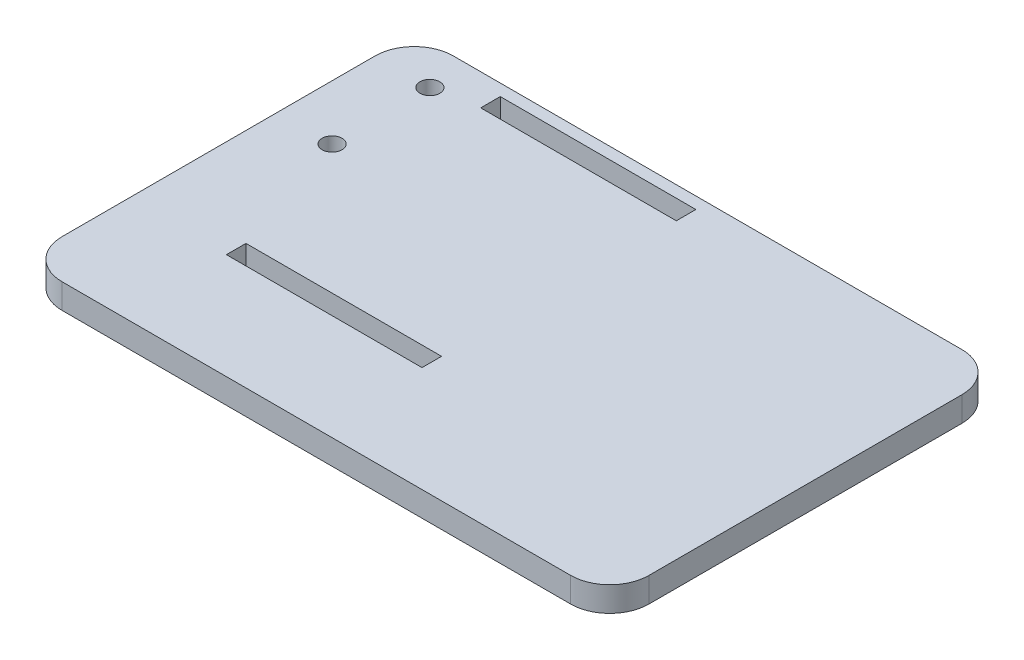
ISO-10303-21;
HEADER;
FILE_DESCRIPTION(('STEP AP214'),'2;1');
FILE_NAME('part.step','',(''),(''),'','','');
FILE_SCHEMA(('AUTOMOTIVE_DESIGN { 1 0 10303 214 1 1 1 1 }'));
ENDSEC;
DATA;
#1=APPLICATION_CONTEXT('core data for automotive mechanical design processes');
#2=APPLICATION_PROTOCOL_DEFINITION('international standard','automotive_design',2000,#1);
#3=PRODUCT_CONTEXT('',#1,'mechanical');
#4=PRODUCT('Part','Part','',(#3));
#5=PRODUCT_RELATED_PRODUCT_CATEGORY('part','',(#4));
#6=PRODUCT_DEFINITION_FORMATION('','',#4);
#7=PRODUCT_DEFINITION_CONTEXT('part definition',#1,'design');
#8=PRODUCT_DEFINITION('design','',#6,#7);
#9=PRODUCT_DEFINITION_SHAPE('','',#8);
#10=(LENGTH_UNIT() NAMED_UNIT(*) SI_UNIT(.MILLI.,.METRE.));
#11=(NAMED_UNIT(*) PLANE_ANGLE_UNIT() SI_UNIT($,.RADIAN.));
#12=(NAMED_UNIT(*) SI_UNIT($,.STERADIAN.) SOLID_ANGLE_UNIT());
#13=UNCERTAINTY_MEASURE_WITH_UNIT(LENGTH_MEASURE(1.E-05),#10,'distance_accuracy_value','');
#14=(GEOMETRIC_REPRESENTATION_CONTEXT(3) GLOBAL_UNCERTAINTY_ASSIGNED_CONTEXT((#13)) GLOBAL_UNIT_ASSIGNED_CONTEXT((#10,
#11,#12)) REPRESENTATION_CONTEXT('',''));
#15=CARTESIAN_POINT('',(0.,0.,0.));
#16=DIRECTION('',(0.,0.,1.));
#17=DIRECTION('',(1.,0.,0.));
#18=AXIS2_PLACEMENT_3D('',#15,#16,#17);
#19=CARTESIAN_POINT('',(0.,6.35,0.));
#20=DIRECTION('',(0.,1.,0.));
#21=DIRECTION('',(0.,0.,1.));
#22=AXIS2_PLACEMENT_3D('',#19,#20,#21);
#23=PLANE('',#22);
#24=CARTESIAN_POINT('',(-61.,6.35,-40.));
#25=DIRECTION('',(0.,1.,0.));
#26=DIRECTION('',(0.,0.,1.));
#27=AXIS2_PLACEMENT_3D('',#24,#25,#26);
#28=CIRCLE('',#27,2.54999999999999);
#29=CARTESIAN_POINT('',(-61.,6.35,-37.45));
#30=VERTEX_POINT('',#29);
#31=EDGE_CURVE('E225',#30,#30,#28,.T.);
#32=ORIENTED_EDGE('',*,*,#31,.F.);
#33=EDGE_LOOP('',(#32));
#34=FACE_BOUND('',#33,.T.);
#35=DIRECTION('',(-1.,0.,0.));
#36=VECTOR('',#35,1.);
#37=CARTESIAN_POINT('',(-75.,6.35,-50.));
#38=LINE('',#37,#36);
#39=CARTESIAN_POINT('',(65.,6.35,-50.));
#40=VERTEX_POINT('',#39);
#41=CARTESIAN_POINT('',(-65.,6.35,-50.));
#42=VERTEX_POINT('',#41);
#43=EDGE_CURVE('E234',#40,#42,#38,.T.);
#44=ORIENTED_EDGE('',*,*,#43,.T.);
#45=CARTESIAN_POINT('',(-65.,6.35,-40.));
#46=DIRECTION('',(0.,1.,0.));
#47=DIRECTION('',(0.,0.,1.));
#48=AXIS2_PLACEMENT_3D('',#45,#46,#47);
#49=CIRCLE('',#48,10.);
#50=CARTESIAN_POINT('',(-75.,6.35,-40.));
#51=VERTEX_POINT('',#50);
#52=EDGE_CURVE('E274',#42,#51,#49,.T.);
#53=ORIENTED_EDGE('',*,*,#52,.T.);
#54=DIRECTION('',(0.,0.,1.));
#55=VECTOR('',#54,1.);
#56=CARTESIAN_POINT('',(-75.,6.35,-50.));
#57=LINE('',#56,#55);
#58=CARTESIAN_POINT('',(-75.,6.35,40.));
#59=VERTEX_POINT('',#58);
#60=EDGE_CURVE('E238',#51,#59,#57,.T.);
#61=ORIENTED_EDGE('',*,*,#60,.T.);
#62=CARTESIAN_POINT('',(-65.,6.35,40.));
#63=DIRECTION('',(0.,1.,0.));
#64=DIRECTION('',(0.,0.,1.));
#65=AXIS2_PLACEMENT_3D('',#62,#63,#64);
#66=CIRCLE('',#65,10.);
#67=CARTESIAN_POINT('',(-65.,6.35,50.));
#68=VERTEX_POINT('',#67);
#69=EDGE_CURVE('E53',#59,#68,#66,.T.);
#70=ORIENTED_EDGE('',*,*,#69,.T.);
#71=DIRECTION('',(1.,0.,0.));
#72=VECTOR('',#71,1.);
#73=CARTESIAN_POINT('',(-75.,6.35,50.));
#74=LINE('',#73,#72);
#75=CARTESIAN_POINT('',(65.,6.35,50.));
#76=VERTEX_POINT('',#75);
#77=EDGE_CURVE('E240',#68,#76,#74,.T.);
#78=ORIENTED_EDGE('',*,*,#77,.T.);
#79=CARTESIAN_POINT('',(65.,6.35,40.));
#80=DIRECTION('',(0.,1.,0.));
#81=DIRECTION('',(0.,0.,1.));
#82=AXIS2_PLACEMENT_3D('',#79,#80,#81);
#83=CIRCLE('',#82,10.);
#84=CARTESIAN_POINT('',(75.,6.35,40.));
#85=VERTEX_POINT('',#84);
#86=EDGE_CURVE('E270',#76,#85,#83,.T.);
#87=ORIENTED_EDGE('',*,*,#86,.T.);
#88=DIRECTION('',(0.,0.,-1.));
#89=VECTOR('',#88,1.);
#90=CARTESIAN_POINT('',(75.,6.35,-50.));
#91=LINE('',#90,#89);
#92=CARTESIAN_POINT('',(75.,6.35,-40.));
#93=VERTEX_POINT('',#92);
#94=EDGE_CURVE('E231',#85,#93,#91,.T.);
#95=ORIENTED_EDGE('',*,*,#94,.T.);
#96=CARTESIAN_POINT('',(65.,6.35,-40.));
#97=DIRECTION('',(0.,1.,0.));
#98=DIRECTION('',(0.,0.,1.));
#99=AXIS2_PLACEMENT_3D('',#96,#97,#98);
#100=CIRCLE('',#99,10.);
#101=EDGE_CURVE('E272',#93,#40,#100,.T.);
#102=ORIENTED_EDGE('',*,*,#101,.T.);
#103=EDGE_LOOP('',(#44,#53,#61,#70,#78,#87,#95,#102));
#104=FACE_BOUND('',#103,.T.);
#105=CARTESIAN_POINT('',(-61.,6.35,-15.));
#106=DIRECTION('',(0.,1.,0.));
#107=DIRECTION('',(0.,0.,1.));
#108=AXIS2_PLACEMENT_3D('',#105,#106,#107);
#109=CIRCLE('',#108,2.54999999999999);
#110=CARTESIAN_POINT('',(-61.,6.35,-12.45));
#111=VERTEX_POINT('',#110);
#112=EDGE_CURVE('E219',#111,#111,#109,.T.);
#113=ORIENTED_EDGE('',*,*,#112,.F.);
#114=EDGE_LOOP('',(#113));
#115=FACE_BOUND('',#114,.T.);
#116=DIRECTION('',(-1.,0.,0.));
#117=VECTOR('',#116,1.);
#118=CARTESIAN_POINT('',(-50.,6.35,-47.));
#119=LINE('',#118,#117);
#120=CARTESIAN_POINT('',(0.,6.35,-47.));
#121=VERTEX_POINT('',#120);
#122=CARTESIAN_POINT('',(-50.,6.35,-47.));
#123=VERTEX_POINT('',#122);
#124=EDGE_CURVE('E190',#121,#123,#119,.T.);
#125=ORIENTED_EDGE('',*,*,#124,.F.);
#126=DIRECTION('',(0.,0.,-1.));
#127=VECTOR('',#126,1.);
#128=CARTESIAN_POINT('',(0.,6.35,-47.));
#129=LINE('',#128,#127);
#130=CARTESIAN_POINT('',(0.,6.35,-42.));
#131=VERTEX_POINT('',#130);
#132=EDGE_CURVE('E188',#131,#121,#129,.T.);
#133=ORIENTED_EDGE('',*,*,#132,.F.);
#134=DIRECTION('',(1.,0.,0.));
#135=VECTOR('',#134,1.);
#136=CARTESIAN_POINT('',(-50.,6.35,-42.));
#137=LINE('',#136,#135);
#138=CARTESIAN_POINT('',(-50.,6.35,-42.));
#139=VERTEX_POINT('',#138);
#140=EDGE_CURVE('E196',#139,#131,#137,.T.);
#141=ORIENTED_EDGE('',*,*,#140,.F.);
#142=DIRECTION('',(0.,0.,1.));
#143=VECTOR('',#142,1.);
#144=CARTESIAN_POINT('',(-50.,6.35,-47.));
#145=LINE('',#144,#143);
#146=EDGE_CURVE('E193',#123,#139,#145,.T.);
#147=ORIENTED_EDGE('',*,*,#146,.F.);
#148=EDGE_LOOP('',(#125,#133,#141,#147));
#149=FACE_BOUND('',#148,.T.);
#150=DIRECTION('',(1.,0.,0.));
#151=VECTOR('',#150,1.);
#152=CARTESIAN_POINT('',(-50.,6.35,23.));
#153=LINE('',#152,#151);
#154=CARTESIAN_POINT('',(-50.,6.35,23.));
#155=VERTEX_POINT('',#154);
#156=CARTESIAN_POINT('',(0.,6.35,23.));
#157=VERTEX_POINT('',#156);
#158=EDGE_CURVE('E157',#155,#157,#153,.T.);
#159=ORIENTED_EDGE('',*,*,#158,.F.);
#160=DIRECTION('',(0.,0.,1.));
#161=VECTOR('',#160,1.);
#162=CARTESIAN_POINT('',(-50.,6.35,23.));
#163=LINE('',#162,#161);
#164=CARTESIAN_POINT('',(-50.,6.35,18.));
#165=VERTEX_POINT('',#164);
#166=EDGE_CURVE('E147',#165,#155,#163,.T.);
#167=ORIENTED_EDGE('',*,*,#166,.F.);
#168=DIRECTION('',(-1.,0.,0.));
#169=VECTOR('',#168,1.);
#170=CARTESIAN_POINT('',(-50.,6.35,18.));
#171=LINE('',#170,#169);
#172=CARTESIAN_POINT('',(0.,6.35,18.));
#173=VERTEX_POINT('',#172);
#174=EDGE_CURVE('E172',#173,#165,#171,.T.);
#175=ORIENTED_EDGE('',*,*,#174,.F.);
#176=DIRECTION('',(0.,0.,-1.));
#177=VECTOR('',#176,1.);
#178=CARTESIAN_POINT('',(0.,6.35,23.));
#179=LINE('',#178,#177);
#180=EDGE_CURVE('E170',#157,#173,#179,.T.);
#181=ORIENTED_EDGE('',*,*,#180,.F.);
#182=EDGE_LOOP('',(#159,#167,#175,#181));
#183=FACE_BOUND('',#182,.T.);
#184=ADVANCED_FACE('F33',(#34,#104,#115,#149,#183),#23,.T.);
#185=CARTESIAN_POINT('',(0.,0.,0.));
#186=DIRECTION('',(0.,1.,0.));
#187=DIRECTION('',(0.,0.,1.));
#188=AXIS2_PLACEMENT_3D('',#185,#186,#187);
#189=PLANE('',#188);
#190=DIRECTION('',(0.,0.,-1.));
#191=VECTOR('',#190,1.);
#192=CARTESIAN_POINT('',(0.,0.,-47.));
#193=LINE('',#192,#191);
#194=CARTESIAN_POINT('',(0.,0.,-42.));
#195=VERTEX_POINT('',#194);
#196=CARTESIAN_POINT('',(0.,0.,-47.));
#197=VERTEX_POINT('',#196);
#198=EDGE_CURVE('E165',#195,#197,#193,.T.);
#199=ORIENTED_EDGE('',*,*,#198,.T.);
#200=DIRECTION('',(-1.,0.,0.));
#201=VECTOR('',#200,1.);
#202=CARTESIAN_POINT('',(-50.,0.,-47.));
#203=LINE('',#202,#201);
#204=CARTESIAN_POINT('',(-50.,0.,-47.));
#205=VERTEX_POINT('',#204);
#206=EDGE_CURVE('E201',#197,#205,#203,.T.);
#207=ORIENTED_EDGE('',*,*,#206,.T.);
#208=DIRECTION('',(0.,0.,1.));
#209=VECTOR('',#208,1.);
#210=CARTESIAN_POINT('',(-50.,0.,-47.));
#211=LINE('',#210,#209);
#212=CARTESIAN_POINT('',(-50.,0.,-42.));
#213=VERTEX_POINT('',#212);
#214=EDGE_CURVE('E204',#205,#213,#211,.T.);
#215=ORIENTED_EDGE('',*,*,#214,.T.);
#216=DIRECTION('',(1.,0.,0.));
#217=VECTOR('',#216,1.);
#218=CARTESIAN_POINT('',(-50.,0.,-42.));
#219=LINE('',#218,#217);
#220=EDGE_CURVE('E191',#213,#195,#219,.T.);
#221=ORIENTED_EDGE('',*,*,#220,.T.);
#222=EDGE_LOOP('',(#199,#207,#215,#221));
#223=FACE_BOUND('',#222,.T.);
#224=DIRECTION('',(0.,0.,1.));
#225=VECTOR('',#224,1.);
#226=CARTESIAN_POINT('',(-75.,0.,-50.));
#227=LINE('',#226,#225);
#228=CARTESIAN_POINT('',(-75.,0.,-40.));
#229=VERTEX_POINT('',#228);
#230=CARTESIAN_POINT('',(-75.,0.,40.));
#231=VERTEX_POINT('',#230);
#232=EDGE_CURVE('E248',#229,#231,#227,.T.);
#233=ORIENTED_EDGE('',*,*,#232,.F.);
#234=CARTESIAN_POINT('',(-65.,0.,-40.));
#235=DIRECTION('',(0.,1.,0.));
#236=DIRECTION('',(0.,0.,1.));
#237=AXIS2_PLACEMENT_3D('',#234,#235,#236);
#238=CIRCLE('',#237,10.);
#239=CARTESIAN_POINT('',(-65.,0.,-50.));
#240=VERTEX_POINT('',#239);
#241=EDGE_CURVE('E262',#229,#240,#238,.F.);
#242=ORIENTED_EDGE('',*,*,#241,.T.);
#243=DIRECTION('',(-1.,0.,0.));
#244=VECTOR('',#243,1.);
#245=CARTESIAN_POINT('',(-75.,0.,-50.));
#246=LINE('',#245,#244);
#247=CARTESIAN_POINT('',(65.,0.,-50.));
#248=VERTEX_POINT('',#247);
#249=EDGE_CURVE('E245',#248,#240,#246,.T.);
#250=ORIENTED_EDGE('',*,*,#249,.F.);
#251=CARTESIAN_POINT('',(65.,0.,-40.));
#252=DIRECTION('',(0.,1.,0.));
#253=DIRECTION('',(0.,0.,1.));
#254=AXIS2_PLACEMENT_3D('',#251,#252,#253);
#255=CIRCLE('',#254,10.);
#256=CARTESIAN_POINT('',(75.,0.,-40.));
#257=VERTEX_POINT('',#256);
#258=EDGE_CURVE('E260',#248,#257,#255,.F.);
#259=ORIENTED_EDGE('',*,*,#258,.T.);
#260=DIRECTION('',(0.,0.,-1.));
#261=VECTOR('',#260,1.);
#262=CARTESIAN_POINT('',(75.,0.,-50.));
#263=LINE('',#262,#261);
#264=CARTESIAN_POINT('',(75.,0.,40.));
#265=VERTEX_POINT('',#264);
#266=EDGE_CURVE('E228',#265,#257,#263,.T.);
#267=ORIENTED_EDGE('',*,*,#266,.F.);
#268=CARTESIAN_POINT('',(65.,0.,40.));
#269=DIRECTION('',(0.,1.,0.));
#270=DIRECTION('',(0.,0.,1.));
#271=AXIS2_PLACEMENT_3D('',#268,#269,#270);
#272=CIRCLE('',#271,10.);
#273=CARTESIAN_POINT('',(65.,0.,50.));
#274=VERTEX_POINT('',#273);
#275=EDGE_CURVE('E258',#265,#274,#272,.F.);
#276=ORIENTED_EDGE('',*,*,#275,.T.);
#277=DIRECTION('',(1.,0.,0.));
#278=VECTOR('',#277,1.);
#279=CARTESIAN_POINT('',(-75.,0.,50.));
#280=LINE('',#279,#278);
#281=CARTESIAN_POINT('',(-65.,0.,50.));
#282=VERTEX_POINT('',#281);
#283=EDGE_CURVE('E235',#282,#274,#280,.T.);
#284=ORIENTED_EDGE('',*,*,#283,.F.);
#285=CARTESIAN_POINT('',(-65.,0.,40.));
#286=DIRECTION('',(0.,1.,0.));
#287=DIRECTION('',(0.,0.,1.));
#288=AXIS2_PLACEMENT_3D('',#285,#286,#287);
#289=CIRCLE('',#288,10.);
#290=EDGE_CURVE('E256',#282,#231,#289,.F.);
#291=ORIENTED_EDGE('',*,*,#290,.T.);
#292=EDGE_LOOP('',(#233,#242,#250,#259,#267,#276,#284,#291));
#293=FACE_BOUND('',#292,.T.);
#294=CARTESIAN_POINT('',(-61.,0.,-40.));
#295=DIRECTION('',(0.,1.,0.));
#296=DIRECTION('',(0.,0.,1.));
#297=AXIS2_PLACEMENT_3D('',#294,#295,#296);
#298=CIRCLE('',#297,2.54999999999999);
#299=CARTESIAN_POINT('',(-61.,0.,-37.45));
#300=VERTEX_POINT('',#299);
#301=EDGE_CURVE('E222',#300,#300,#298,.T.);
#302=ORIENTED_EDGE('',*,*,#301,.T.);
#303=EDGE_LOOP('',(#302));
#304=FACE_BOUND('',#303,.T.);
#305=CARTESIAN_POINT('',(-61.,0.,-15.));
#306=DIRECTION('',(0.,1.,0.));
#307=DIRECTION('',(0.,0.,1.));
#308=AXIS2_PLACEMENT_3D('',#305,#306,#307);
#309=CIRCLE('',#308,2.54999999999999);
#310=CARTESIAN_POINT('',(-61.,0.,-12.45));
#311=VERTEX_POINT('',#310);
#312=EDGE_CURVE('E218',#311,#311,#309,.T.);
#313=ORIENTED_EDGE('',*,*,#312,.T.);
#314=EDGE_LOOP('',(#313));
#315=FACE_BOUND('',#314,.T.);
#316=DIRECTION('',(0.,0.,1.));
#317=VECTOR('',#316,1.);
#318=CARTESIAN_POINT('',(-50.,0.,23.));
#319=LINE('',#318,#317);
#320=CARTESIAN_POINT('',(-50.,0.,18.));
#321=VERTEX_POINT('',#320);
#322=CARTESIAN_POINT('',(-50.,0.,23.));
#323=VERTEX_POINT('',#322);
#324=EDGE_CURVE('E176',#321,#323,#319,.T.);
#325=ORIENTED_EDGE('',*,*,#324,.T.);
#326=DIRECTION('',(1.,0.,0.));
#327=VECTOR('',#326,1.);
#328=CARTESIAN_POINT('',(-50.,0.,23.));
#329=LINE('',#328,#327);
#330=CARTESIAN_POINT('',(0.,0.,23.));
#331=VERTEX_POINT('',#330);
#332=EDGE_CURVE('E164',#323,#331,#329,.T.);
#333=ORIENTED_EDGE('',*,*,#332,.T.);
#334=DIRECTION('',(0.,0.,-1.));
#335=VECTOR('',#334,1.);
#336=CARTESIAN_POINT('',(0.,0.,23.));
#337=LINE('',#336,#335);
#338=CARTESIAN_POINT('',(0.,0.,18.));
#339=VERTEX_POINT('',#338);
#340=EDGE_CURVE('E179',#331,#339,#337,.T.);
#341=ORIENTED_EDGE('',*,*,#340,.T.);
#342=DIRECTION('',(-1.,0.,0.));
#343=VECTOR('',#342,1.);
#344=CARTESIAN_POINT('',(-50.,0.,18.));
#345=LINE('',#344,#343);
#346=EDGE_CURVE('E158',#339,#321,#345,.T.);
#347=ORIENTED_EDGE('',*,*,#346,.T.);
#348=EDGE_LOOP('',(#325,#333,#341,#347));
#349=FACE_BOUND('',#348,.T.);
#350=ADVANCED_FACE('F287',(#223,#293,#304,#315,#349),#189,.F.);
#351=CARTESIAN_POINT('',(75.,6.35,-50.));
#352=DIRECTION('',(-1.,0.,0.));
#353=DIRECTION('',(0.,0.,1.));
#354=AXIS2_PLACEMENT_3D('',#351,#352,#353);
#355=PLANE('',#354);
#356=ORIENTED_EDGE('',*,*,#266,.T.);
#357=DIRECTION('',(0.,-1.,0.));
#358=VECTOR('',#357,1.);
#359=CARTESIAN_POINT('',(75.,6.35,-40.));
#360=LINE('',#359,#358);
#361=EDGE_CURVE('E279',#257,#93,#360,.F.);
#362=ORIENTED_EDGE('',*,*,#361,.T.);
#363=ORIENTED_EDGE('',*,*,#94,.F.);
#364=DIRECTION('',(0.,-1.,0.));
#365=VECTOR('',#364,1.);
#366=CARTESIAN_POINT('',(75.,6.35,40.));
#367=LINE('',#366,#365);
#368=EDGE_CURVE('E276',#85,#265,#367,.T.);
#369=ORIENTED_EDGE('',*,*,#368,.T.);
#370=EDGE_LOOP('',(#356,#362,#363,#369));
#371=FACE_BOUND('',#370,.T.);
#372=ADVANCED_FACE('F296',(#371),#355,.F.);
#373=CARTESIAN_POINT('',(-75.,6.35,-50.));
#374=DIRECTION('',(0.,0.,1.));
#375=DIRECTION('',(1.,0.,0.));
#376=AXIS2_PLACEMENT_3D('',#373,#374,#375);
#377=PLANE('',#376);
#378=ORIENTED_EDGE('',*,*,#249,.T.);
#379=DIRECTION('',(0.,-1.,0.));
#380=VECTOR('',#379,1.);
#381=CARTESIAN_POINT('',(-65.,6.35,-50.));
#382=LINE('',#381,#380);
#383=EDGE_CURVE('E267',#240,#42,#382,.F.);
#384=ORIENTED_EDGE('',*,*,#383,.T.);
#385=ORIENTED_EDGE('',*,*,#43,.F.);
#386=DIRECTION('',(0.,-1.,0.));
#387=VECTOR('',#386,1.);
#388=CARTESIAN_POINT('',(65.,6.35,-50.));
#389=LINE('',#388,#387);
#390=EDGE_CURVE('E264',#40,#248,#389,.T.);
#391=ORIENTED_EDGE('',*,*,#390,.T.);
#392=EDGE_LOOP('',(#378,#384,#385,#391));
#393=FACE_BOUND('',#392,.T.);
#394=ADVANCED_FACE('F306',(#393),#377,.F.);
#395=CARTESIAN_POINT('',(-75.,6.35,-50.));
#396=DIRECTION('',(1.,0.,0.));
#397=DIRECTION('',(0.,0.,-1.));
#398=AXIS2_PLACEMENT_3D('',#395,#396,#397);
#399=PLANE('',#398);
#400=ORIENTED_EDGE('',*,*,#60,.F.);
#401=DIRECTION('',(0.,-1.,0.));
#402=VECTOR('',#401,1.);
#403=CARTESIAN_POINT('',(-75.,6.35,-40.));
#404=LINE('',#403,#402);
#405=EDGE_CURVE('E253',#51,#229,#404,.T.);
#406=ORIENTED_EDGE('',*,*,#405,.T.);
#407=ORIENTED_EDGE('',*,*,#232,.T.);
#408=DIRECTION('',(0.,-1.,0.));
#409=VECTOR('',#408,1.);
#410=CARTESIAN_POINT('',(-75.,6.35,40.));
#411=LINE('',#410,#409);
#412=EDGE_CURVE('E242',#231,#59,#411,.F.);
#413=ORIENTED_EDGE('',*,*,#412,.T.);
#414=EDGE_LOOP('',(#400,#406,#407,#413));
#415=FACE_BOUND('',#414,.T.);
#416=ADVANCED_FACE('F314',(#415),#399,.F.);
#417=CARTESIAN_POINT('',(-75.,6.35,50.));
#418=DIRECTION('',(0.,0.,-1.));
#419=DIRECTION('',(-1.,0.,0.));
#420=AXIS2_PLACEMENT_3D('',#417,#418,#419);
#421=PLANE('',#420);
#422=ORIENTED_EDGE('',*,*,#283,.T.);
#423=DIRECTION('',(0.,-1.,0.));
#424=VECTOR('',#423,1.);
#425=CARTESIAN_POINT('',(65.,6.35,50.));
#426=LINE('',#425,#424);
#427=EDGE_CURVE('E11',#274,#76,#426,.F.);
#428=ORIENTED_EDGE('',*,*,#427,.T.);
#429=ORIENTED_EDGE('',*,*,#77,.F.);
#430=DIRECTION('',(0.,-1.,0.));
#431=VECTOR('',#430,1.);
#432=CARTESIAN_POINT('',(-65.,6.35,50.));
#433=LINE('',#432,#431);
#434=EDGE_CURVE('E41',#68,#282,#433,.T.);
#435=ORIENTED_EDGE('',*,*,#434,.T.);
#436=EDGE_LOOP('',(#422,#428,#429,#435));
#437=FACE_BOUND('',#436,.T.);
#438=ADVANCED_FACE('F283',(#437),#421,.F.);
#439=CARTESIAN_POINT('',(-61.,6.35,-40.));
#440=DIRECTION('',(0.,-1.,0.));
#441=DIRECTION('',(0.,0.,-1.));
#442=AXIS2_PLACEMENT_3D('',#439,#440,#441);
#443=CYLINDRICAL_SURFACE('',#442,2.54999999999999);
#444=ORIENTED_EDGE('',*,*,#31,.T.);
#445=EDGE_LOOP('',(#444));
#446=FACE_BOUND('',#445,.T.);
#447=ORIENTED_EDGE('',*,*,#301,.F.);
#448=EDGE_LOOP('',(#447));
#449=FACE_BOUND('',#448,.T.);
#450=ADVANCED_FACE('F330',(#446,#449),#443,.F.);
#451=CARTESIAN_POINT('',(-61.,6.35,-15.));
#452=DIRECTION('',(0.,-1.,0.));
#453=DIRECTION('',(0.,0.,-1.));
#454=AXIS2_PLACEMENT_3D('',#451,#452,#453);
#455=CYLINDRICAL_SURFACE('',#454,2.54999999999999);
#456=ORIENTED_EDGE('',*,*,#112,.T.);
#457=EDGE_LOOP('',(#456));
#458=FACE_BOUND('',#457,.T.);
#459=ORIENTED_EDGE('',*,*,#312,.F.);
#460=EDGE_LOOP('',(#459));
#461=FACE_BOUND('',#460,.T.);
#462=ADVANCED_FACE('F433',(#458,#461),#455,.F.);
#463=CARTESIAN_POINT('',(0.,6.35,-47.));
#464=DIRECTION('',(-1.,0.,0.));
#465=DIRECTION('',(0.,0.,1.));
#466=AXIS2_PLACEMENT_3D('',#463,#464,#465);
#467=PLANE('',#466);
#468=ORIENTED_EDGE('',*,*,#198,.F.);
#469=DIRECTION('',(0.,-1.,0.));
#470=VECTOR('',#469,1.);
#471=CARTESIAN_POINT('',(0.,6.35,-42.));
#472=LINE('',#471,#470);
#473=EDGE_CURVE('E198',#131,#195,#472,.T.);
#474=ORIENTED_EDGE('',*,*,#473,.F.);
#475=ORIENTED_EDGE('',*,*,#132,.T.);
#476=DIRECTION('',(0.,-1.,0.));
#477=VECTOR('',#476,1.);
#478=CARTESIAN_POINT('',(0.,6.35,-47.));
#479=LINE('',#478,#477);
#480=EDGE_CURVE('E215',#121,#197,#479,.T.);
#481=ORIENTED_EDGE('',*,*,#480,.T.);
#482=EDGE_LOOP('',(#468,#474,#475,#481));
#483=FACE_BOUND('',#482,.T.);
#484=ADVANCED_FACE('F424',(#483),#467,.T.);
#485=CARTESIAN_POINT('',(-50.,6.35,-47.));
#486=DIRECTION('',(0.,0.,1.));
#487=DIRECTION('',(1.,0.,0.));
#488=AXIS2_PLACEMENT_3D('',#485,#486,#487);
#489=PLANE('',#488);
#490=ORIENTED_EDGE('',*,*,#206,.F.);
#491=ORIENTED_EDGE('',*,*,#480,.F.);
#492=ORIENTED_EDGE('',*,*,#124,.T.);
#493=DIRECTION('',(0.,-1.,0.));
#494=VECTOR('',#493,1.);
#495=CARTESIAN_POINT('',(-50.,6.35,-47.));
#496=LINE('',#495,#494);
#497=EDGE_CURVE('E213',#123,#205,#496,.T.);
#498=ORIENTED_EDGE('',*,*,#497,.T.);
#499=EDGE_LOOP('',(#490,#491,#492,#498));
#500=FACE_BOUND('',#499,.T.);
#501=ADVANCED_FACE('F415',(#500),#489,.T.);
#502=CARTESIAN_POINT('',(-50.,6.35,-47.));
#503=DIRECTION('',(1.,0.,0.));
#504=DIRECTION('',(0.,0.,-1.));
#505=AXIS2_PLACEMENT_3D('',#502,#503,#504);
#506=PLANE('',#505);
#507=ORIENTED_EDGE('',*,*,#214,.F.);
#508=ORIENTED_EDGE('',*,*,#497,.F.);
#509=ORIENTED_EDGE('',*,*,#146,.T.);
#510=DIRECTION('',(0.,-1.,0.));
#511=VECTOR('',#510,1.);
#512=CARTESIAN_POINT('',(-50.,6.35,-42.));
#513=LINE('',#512,#511);
#514=EDGE_CURVE('E211',#139,#213,#513,.T.);
#515=ORIENTED_EDGE('',*,*,#514,.T.);
#516=EDGE_LOOP('',(#507,#508,#509,#515));
#517=FACE_BOUND('',#516,.T.);
#518=ADVANCED_FACE('F406',(#517),#506,.T.);
#519=CARTESIAN_POINT('',(-50.,6.35,-42.));
#520=DIRECTION('',(0.,0.,-1.));
#521=DIRECTION('',(-1.,0.,0.));
#522=AXIS2_PLACEMENT_3D('',#519,#520,#521);
#523=PLANE('',#522);
#524=ORIENTED_EDGE('',*,*,#220,.F.);
#525=ORIENTED_EDGE('',*,*,#514,.F.);
#526=ORIENTED_EDGE('',*,*,#140,.T.);
#527=ORIENTED_EDGE('',*,*,#473,.T.);
#528=EDGE_LOOP('',(#524,#525,#526,#527));
#529=FACE_BOUND('',#528,.T.);
#530=ADVANCED_FACE('F398',(#529),#523,.T.);
#531=CARTESIAN_POINT('',(-50.,6.35,23.));
#532=DIRECTION('',(1.,0.,0.));
#533=DIRECTION('',(0.,0.,-1.));
#534=AXIS2_PLACEMENT_3D('',#531,#532,#533);
#535=PLANE('',#534);
#536=ORIENTED_EDGE('',*,*,#324,.F.);
#537=DIRECTION('',(0.,-1.,0.));
#538=VECTOR('',#537,1.);
#539=CARTESIAN_POINT('',(-50.,6.35,18.));
#540=LINE('',#539,#538);
#541=EDGE_CURVE('E153',#165,#321,#540,.T.);
#542=ORIENTED_EDGE('',*,*,#541,.F.);
#543=ORIENTED_EDGE('',*,*,#166,.T.);
#544=DIRECTION('',(0.,-1.,0.));
#545=VECTOR('',#544,1.);
#546=CARTESIAN_POINT('',(-50.,6.35,23.));
#547=LINE('',#546,#545);
#548=EDGE_CURVE('E150',#155,#323,#547,.T.);
#549=ORIENTED_EDGE('',*,*,#548,.T.);
#550=EDGE_LOOP('',(#536,#542,#543,#549));
#551=FACE_BOUND('',#550,.T.);
#552=ADVANCED_FACE('F149',(#551),#535,.T.);
#553=CARTESIAN_POINT('',(-50.,6.35,23.));
#554=DIRECTION('',(0.,0.,-1.));
#555=DIRECTION('',(-1.,0.,0.));
#556=AXIS2_PLACEMENT_3D('',#553,#554,#555);
#557=PLANE('',#556);
#558=ORIENTED_EDGE('',*,*,#332,.F.);
#559=ORIENTED_EDGE('',*,*,#548,.F.);
#560=ORIENTED_EDGE('',*,*,#158,.T.);
#561=DIRECTION('',(0.,-1.,0.));
#562=VECTOR('',#561,1.);
#563=CARTESIAN_POINT('',(0.,6.35,23.));
#564=LINE('',#563,#562);
#565=EDGE_CURVE('E166',#157,#331,#564,.T.);
#566=ORIENTED_EDGE('',*,*,#565,.T.);
#567=EDGE_LOOP('',(#558,#559,#560,#566));
#568=FACE_BOUND('',#567,.T.);
#569=ADVANCED_FACE('F161',(#568),#557,.T.);
#570=CARTESIAN_POINT('',(0.,6.35,23.));
#571=DIRECTION('',(-1.,0.,0.));
#572=DIRECTION('',(0.,0.,1.));
#573=AXIS2_PLACEMENT_3D('',#570,#571,#572);
#574=PLANE('',#573);
#575=ORIENTED_EDGE('',*,*,#340,.F.);
#576=ORIENTED_EDGE('',*,*,#565,.F.);
#577=ORIENTED_EDGE('',*,*,#180,.T.);
#578=DIRECTION('',(0.,-1.,0.));
#579=VECTOR('',#578,1.);
#580=CARTESIAN_POINT('',(0.,6.35,18.));
#581=LINE('',#580,#579);
#582=EDGE_CURVE('E185',#173,#339,#581,.T.);
#583=ORIENTED_EDGE('',*,*,#582,.T.);
#584=EDGE_LOOP('',(#575,#576,#577,#583));
#585=FACE_BOUND('',#584,.T.);
#586=ADVANCED_FACE('F374',(#585),#574,.T.);
#587=CARTESIAN_POINT('',(-50.,6.35,18.));
#588=DIRECTION('',(0.,0.,1.));
#589=DIRECTION('',(1.,0.,0.));
#590=AXIS2_PLACEMENT_3D('',#587,#588,#589);
#591=PLANE('',#590);
#592=ORIENTED_EDGE('',*,*,#346,.F.);
#593=ORIENTED_EDGE('',*,*,#582,.F.);
#594=ORIENTED_EDGE('',*,*,#174,.T.);
#595=ORIENTED_EDGE('',*,*,#541,.T.);
#596=EDGE_LOOP('',(#592,#593,#594,#595));
#597=FACE_BOUND('',#596,.T.);
#598=ADVANCED_FACE('F343',(#597),#591,.T.);
#599=CARTESIAN_POINT('',(-65.,6.35,-40.));
#600=DIRECTION('',(0.,-1.,0.));
#601=DIRECTION('',(0.,0.,-1.));
#602=AXIS2_PLACEMENT_3D('',#599,#600,#601);
#603=CYLINDRICAL_SURFACE('',#602,10.);
#604=ORIENTED_EDGE('',*,*,#52,.F.);
#605=ORIENTED_EDGE('',*,*,#383,.F.);
#606=ORIENTED_EDGE('',*,*,#241,.F.);
#607=ORIENTED_EDGE('',*,*,#405,.F.);
#608=EDGE_LOOP('',(#604,#605,#606,#607));
#609=FACE_BOUND('',#608,.T.);
#610=ADVANCED_FACE('F311',(#609),#603,.T.);
#611=CARTESIAN_POINT('',(65.,6.35,-40.));
#612=DIRECTION('',(0.,-1.,0.));
#613=DIRECTION('',(0.,0.,-1.));
#614=AXIS2_PLACEMENT_3D('',#611,#612,#613);
#615=CYLINDRICAL_SURFACE('',#614,10.);
#616=ORIENTED_EDGE('',*,*,#101,.F.);
#617=ORIENTED_EDGE('',*,*,#361,.F.);
#618=ORIENTED_EDGE('',*,*,#258,.F.);
#619=ORIENTED_EDGE('',*,*,#390,.F.);
#620=EDGE_LOOP('',(#616,#617,#618,#619));
#621=FACE_BOUND('',#620,.T.);
#622=ADVANCED_FACE('F303',(#621),#615,.T.);
#623=CARTESIAN_POINT('',(65.,6.35,40.));
#624=DIRECTION('',(0.,-1.,0.));
#625=DIRECTION('',(0.,0.,-1.));
#626=AXIS2_PLACEMENT_3D('',#623,#624,#625);
#627=CYLINDRICAL_SURFACE('',#626,10.);
#628=ORIENTED_EDGE('',*,*,#86,.F.);
#629=ORIENTED_EDGE('',*,*,#427,.F.);
#630=ORIENTED_EDGE('',*,*,#275,.F.);
#631=ORIENTED_EDGE('',*,*,#368,.F.);
#632=EDGE_LOOP('',(#628,#629,#630,#631));
#633=FACE_BOUND('',#632,.T.);
#634=ADVANCED_FACE('F293',(#633),#627,.T.);
#635=CARTESIAN_POINT('',(-65.,6.35,40.));
#636=DIRECTION('',(0.,-1.,0.));
#637=DIRECTION('',(0.,0.,-1.));
#638=AXIS2_PLACEMENT_3D('',#635,#636,#637);
#639=CYLINDRICAL_SURFACE('',#638,10.);
#640=ORIENTED_EDGE('',*,*,#69,.F.);
#641=ORIENTED_EDGE('',*,*,#412,.F.);
#642=ORIENTED_EDGE('',*,*,#290,.F.);
#643=ORIENTED_EDGE('',*,*,#434,.F.);
#644=EDGE_LOOP('',(#640,#641,#642,#643));
#645=FACE_BOUND('',#644,.T.);
#646=ADVANCED_FACE('F35',(#645),#639,.T.);
#647=CLOSED_SHELL('',(#184,#350,#372,#394,#416,#438,#450,#462,#484,#501,#518,#530,#552,#569,
#586,#598,#610,#622,#634,#646));
#648=MANIFOLD_SOLID_BREP('B2',#647);
#649=ADVANCED_BREP_SHAPE_REPRESENTATION('',(#18,#648),#14);
#650=SHAPE_DEFINITION_REPRESENTATION(#9,#649);
ENDSEC;
END-ISO-10303-21;
